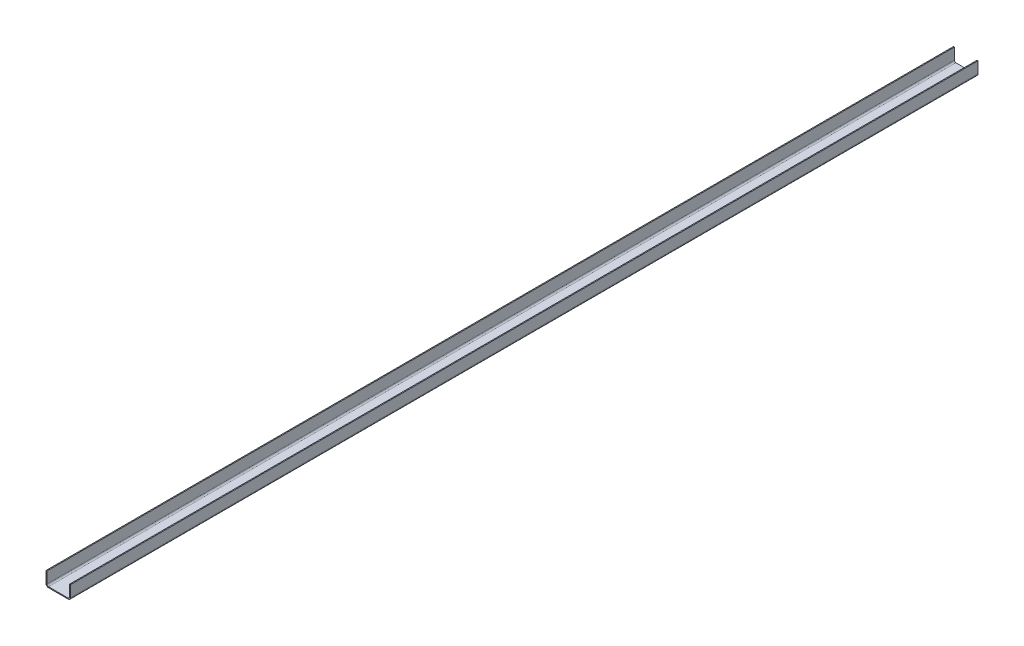
ISO-10303-21;
HEADER;
FILE_DESCRIPTION(('STEP AP214'),'2;1');
FILE_NAME('part.step','',(''),(''),'','','');
FILE_SCHEMA(('AUTOMOTIVE_DESIGN { 1 0 10303 214 1 1 1 1 }'));
ENDSEC;
DATA;
#1=APPLICATION_CONTEXT('core data for automotive mechanical design processes');
#2=APPLICATION_PROTOCOL_DEFINITION('international standard','automotive_design',2000,#1);
#3=PRODUCT_CONTEXT('',#1,'mechanical');
#4=PRODUCT('Part','Part','',(#3));
#5=PRODUCT_RELATED_PRODUCT_CATEGORY('part','',(#4));
#6=PRODUCT_DEFINITION_FORMATION('','',#4);
#7=PRODUCT_DEFINITION_CONTEXT('part definition',#1,'design');
#8=PRODUCT_DEFINITION('design','',#6,#7);
#9=PRODUCT_DEFINITION_SHAPE('','',#8);
#10=(LENGTH_UNIT() NAMED_UNIT(*) SI_UNIT(.MILLI.,.METRE.));
#11=(NAMED_UNIT(*) PLANE_ANGLE_UNIT() SI_UNIT($,.RADIAN.));
#12=(NAMED_UNIT(*) SI_UNIT($,.STERADIAN.) SOLID_ANGLE_UNIT());
#13=UNCERTAINTY_MEASURE_WITH_UNIT(LENGTH_MEASURE(1.E-05),#10,'distance_accuracy_value','');
#14=(GEOMETRIC_REPRESENTATION_CONTEXT(3) GLOBAL_UNCERTAINTY_ASSIGNED_CONTEXT((#13)) GLOBAL_UNIT_ASSIGNED_CONTEXT((#10,
#11,#12)) REPRESENTATION_CONTEXT('',''));
#15=CARTESIAN_POINT('',(0.,0.,0.));
#16=DIRECTION('',(0.,0.,1.));
#17=DIRECTION('',(1.,0.,0.));
#18=AXIS2_PLACEMENT_3D('',#15,#16,#17);
#19=CARTESIAN_POINT('',(2.,0.,1200.));
#20=DIRECTION('',(0.,0.,1.));
#21=DIRECTION('',(1.,0.,0.));
#22=AXIS2_PLACEMENT_3D('',#19,#20,#21);
#23=PLANE('',#22);
#24=DIRECTION('',(0.,-1.,0.));
#25=VECTOR('',#24,1.);
#26=CARTESIAN_POINT('',(2.,0.,1200.));
#27=LINE('',#26,#25);
#28=CARTESIAN_POINT('',(2.,0.,1200.));
#29=VERTEX_POINT('',#28);
#30=CARTESIAN_POINT('',(2.,-1.25,1200.));
#31=VERTEX_POINT('',#30);
#32=EDGE_CURVE('E11',#29,#31,#27,.T.);
#33=ORIENTED_EDGE('',*,*,#32,.F.);
#34=CARTESIAN_POINT('',(2.,2.,1200.));
#35=DIRECTION('',(0.,0.,-1.));
#36=DIRECTION('',(-1.,0.,0.));
#37=AXIS2_PLACEMENT_3D('',#34,#35,#36);
#38=CIRCLE('',#37,2.);
#39=CARTESIAN_POINT('',(0.,2.,1200.));
#40=VERTEX_POINT('',#39);
#41=EDGE_CURVE('E246',#40,#29,#38,.F.);
#42=ORIENTED_EDGE('',*,*,#41,.F.);
#43=DIRECTION('',(1.,0.,0.));
#44=VECTOR('',#43,1.);
#45=CARTESIAN_POINT('',(-1.25,2.,1200.));
#46=LINE('',#45,#44);
#47=CARTESIAN_POINT('',(-1.25,2.,1200.));
#48=VERTEX_POINT('',#47);
#49=EDGE_CURVE('E44',#48,#40,#46,.T.);
#50=ORIENTED_EDGE('',*,*,#49,.F.);
#51=CARTESIAN_POINT('',(2.,2.,1200.));
#52=DIRECTION('',(0.,0.,1.));
#53=DIRECTION('',(1.,0.,0.));
#54=AXIS2_PLACEMENT_3D('',#51,#52,#53);
#55=CIRCLE('',#54,3.25);
#56=EDGE_CURVE('E145',#48,#31,#55,.T.);
#57=ORIENTED_EDGE('',*,*,#56,.T.);
#58=EDGE_LOOP('',(#33,#42,#50,#57));
#59=FACE_BOUND('',#58,.T.);
#60=ADVANCED_FACE('F36',(#59),#23,.T.);
#61=CARTESIAN_POINT('',(-1.25,2.,1200.));
#62=DIRECTION('',(0.,0.,1.));
#63=DIRECTION('',(1.,0.,0.));
#64=AXIS2_PLACEMENT_3D('',#61,#62,#63);
#65=PLANE('',#64);
#66=DIRECTION('',(1.,0.,0.));
#67=VECTOR('',#66,1.);
#68=CARTESIAN_POINT('',(0.,0.,1200.));
#69=LINE('',#68,#67);
#70=CARTESIAN_POINT('',(28.,0.,1200.));
#71=VERTEX_POINT('',#70);
#72=EDGE_CURVE('E139',#29,#71,#69,.T.);
#73=ORIENTED_EDGE('',*,*,#72,.F.);
#74=ORIENTED_EDGE('',*,*,#32,.T.);
#75=DIRECTION('',(1.,0.,0.));
#76=VECTOR('',#75,1.);
#77=CARTESIAN_POINT('',(0.,-1.25,1200.));
#78=LINE('',#77,#76);
#79=CARTESIAN_POINT('',(28.,-1.25,1200.));
#80=VERTEX_POINT('',#79);
#81=EDGE_CURVE('E136',#31,#80,#78,.T.);
#82=ORIENTED_EDGE('',*,*,#81,.T.);
#83=DIRECTION('',(0.,1.,0.));
#84=VECTOR('',#83,1.);
#85=CARTESIAN_POINT('',(28.,-1.25,1200.));
#86=LINE('',#85,#84);
#87=EDGE_CURVE('E227',#80,#71,#86,.T.);
#88=ORIENTED_EDGE('',*,*,#87,.T.);
#89=EDGE_LOOP('',(#73,#74,#82,#88));
#90=FACE_BOUND('',#89,.T.);
#91=ADVANCED_FACE('F134',(#90),#65,.T.);
#92=CARTESIAN_POINT('',(0.,2.,0.));
#93=DIRECTION('',(0.,0.,-1.));
#94=DIRECTION('',(-1.,0.,0.));
#95=AXIS2_PLACEMENT_3D('',#92,#93,#94);
#96=PLANE('',#95);
#97=DIRECTION('',(-1.,0.,0.));
#98=VECTOR('',#97,1.);
#99=CARTESIAN_POINT('',(0.,2.,0.));
#100=LINE('',#99,#98);
#101=CARTESIAN_POINT('',(0.,2.,0.));
#102=VERTEX_POINT('',#101);
#103=CARTESIAN_POINT('',(-1.25,2.,0.));
#104=VERTEX_POINT('',#103);
#105=EDGE_CURVE('E232',#102,#104,#100,.T.);
#106=ORIENTED_EDGE('',*,*,#105,.F.);
#107=CARTESIAN_POINT('',(2.,2.,0.));
#108=DIRECTION('',(0.,0.,-1.));
#109=DIRECTION('',(-1.,0.,0.));
#110=AXIS2_PLACEMENT_3D('',#107,#108,#109);
#111=CIRCLE('',#110,2.);
#112=CARTESIAN_POINT('',(2.,0.,0.));
#113=VERTEX_POINT('',#112);
#114=EDGE_CURVE('E184',#102,#113,#111,.F.);
#115=ORIENTED_EDGE('',*,*,#114,.T.);
#116=DIRECTION('',(0.,1.,0.));
#117=VECTOR('',#116,1.);
#118=CARTESIAN_POINT('',(2.,-1.25,0.));
#119=LINE('',#118,#117);
#120=CARTESIAN_POINT('',(2.,-1.25,0.));
#121=VERTEX_POINT('',#120);
#122=EDGE_CURVE('E230',#121,#113,#119,.T.);
#123=ORIENTED_EDGE('',*,*,#122,.F.);
#124=CARTESIAN_POINT('',(2.,2.,0.));
#125=DIRECTION('',(0.,0.,1.));
#126=DIRECTION('',(1.,0.,0.));
#127=AXIS2_PLACEMENT_3D('',#124,#125,#126);
#128=CIRCLE('',#127,3.25);
#129=EDGE_CURVE('E157',#104,#121,#128,.T.);
#130=ORIENTED_EDGE('',*,*,#129,.F.);
#131=EDGE_LOOP('',(#106,#115,#123,#130));
#132=FACE_BOUND('',#131,.T.);
#133=ADVANCED_FACE('F284',(#132),#96,.T.);
#134=CARTESIAN_POINT('',(2.,-1.25,0.));
#135=DIRECTION('',(0.,0.,-1.));
#136=DIRECTION('',(-1.,0.,0.));
#137=AXIS2_PLACEMENT_3D('',#134,#135,#136);
#138=PLANE('',#137);
#139=DIRECTION('',(0.,-1.,0.));
#140=VECTOR('',#139,1.);
#141=CARTESIAN_POINT('',(0.,17.,0.));
#142=LINE('',#141,#140);
#143=CARTESIAN_POINT('',(0.,17.,0.));
#144=VERTEX_POINT('',#143);
#145=EDGE_CURVE('E187',#144,#102,#142,.T.);
#146=ORIENTED_EDGE('',*,*,#145,.T.);
#147=ORIENTED_EDGE('',*,*,#105,.T.);
#148=DIRECTION('',(0.,-1.,0.));
#149=VECTOR('',#148,1.);
#150=CARTESIAN_POINT('',(-1.25,17.,0.));
#151=LINE('',#150,#149);
#152=CARTESIAN_POINT('',(-1.25,17.,0.));
#153=VERTEX_POINT('',#152);
#154=EDGE_CURVE('E193',#153,#104,#151,.T.);
#155=ORIENTED_EDGE('',*,*,#154,.F.);
#156=DIRECTION('',(1.,0.,0.));
#157=VECTOR('',#156,1.);
#158=CARTESIAN_POINT('',(-1.25,17.,0.));
#159=LINE('',#158,#157);
#160=EDGE_CURVE('E190',#153,#144,#159,.T.);
#161=ORIENTED_EDGE('',*,*,#160,.T.);
#162=EDGE_LOOP('',(#146,#147,#155,#161));
#163=FACE_BOUND('',#162,.T.);
#164=ADVANCED_FACE('F287',(#163),#138,.T.);
#165=CARTESIAN_POINT('',(30.,2.,1200.));
#166=DIRECTION('',(0.,0.,1.));
#167=DIRECTION('',(1.,0.,0.));
#168=AXIS2_PLACEMENT_3D('',#165,#166,#167);
#169=PLANE('',#168);
#170=DIRECTION('',(1.,0.,0.));
#171=VECTOR('',#170,1.);
#172=CARTESIAN_POINT('',(30.,2.,1200.));
#173=LINE('',#172,#171);
#174=CARTESIAN_POINT('',(30.,2.,1200.));
#175=VERTEX_POINT('',#174);
#176=CARTESIAN_POINT('',(31.25,2.,1200.));
#177=VERTEX_POINT('',#176);
#178=EDGE_CURVE('E52',#175,#177,#173,.T.);
#179=ORIENTED_EDGE('',*,*,#178,.F.);
#180=CARTESIAN_POINT('',(28.,2.,1200.));
#181=DIRECTION('',(0.,0.,-1.));
#182=DIRECTION('',(-1.,0.,0.));
#183=AXIS2_PLACEMENT_3D('',#180,#181,#182);
#184=CIRCLE('',#183,2.);
#185=EDGE_CURVE('E256',#71,#175,#184,.F.);
#186=ORIENTED_EDGE('',*,*,#185,.F.);
#187=ORIENTED_EDGE('',*,*,#87,.F.);
#188=CARTESIAN_POINT('',(28.,2.,1200.));
#189=DIRECTION('',(0.,0.,1.));
#190=DIRECTION('',(1.,0.,0.));
#191=AXIS2_PLACEMENT_3D('',#188,#189,#190);
#192=CIRCLE('',#191,3.25);
#193=EDGE_CURVE('E165',#80,#177,#192,.T.);
#194=ORIENTED_EDGE('',*,*,#193,.T.);
#195=EDGE_LOOP('',(#179,#186,#187,#194));
#196=FACE_BOUND('',#195,.T.);
#197=ADVANCED_FACE('F279',(#196),#169,.T.);
#198=CARTESIAN_POINT('',(28.,-1.25,1200.));
#199=DIRECTION('',(0.,0.,1.));
#200=DIRECTION('',(1.,0.,0.));
#201=AXIS2_PLACEMENT_3D('',#198,#199,#200);
#202=PLANE('',#201);
#203=DIRECTION('',(0.,1.,0.));
#204=VECTOR('',#203,1.);
#205=CARTESIAN_POINT('',(30.,0.,1200.));
#206=LINE('',#205,#204);
#207=CARTESIAN_POINT('',(30.,17.,1200.));
#208=VERTEX_POINT('',#207);
#209=EDGE_CURVE('E259',#175,#208,#206,.T.);
#210=ORIENTED_EDGE('',*,*,#209,.F.);
#211=ORIENTED_EDGE('',*,*,#178,.T.);
#212=DIRECTION('',(0.,1.,0.));
#213=VECTOR('',#212,1.);
#214=CARTESIAN_POINT('',(31.25,0.,1200.));
#215=LINE('',#214,#213);
#216=CARTESIAN_POINT('',(31.25,17.,1200.));
#217=VERTEX_POINT('',#216);
#218=EDGE_CURVE('E106',#177,#217,#215,.T.);
#219=ORIENTED_EDGE('',*,*,#218,.T.);
#220=DIRECTION('',(1.,0.,0.));
#221=VECTOR('',#220,1.);
#222=CARTESIAN_POINT('',(30.,17.,1200.));
#223=LINE('',#222,#221);
#224=EDGE_CURVE('E262',#208,#217,#223,.T.);
#225=ORIENTED_EDGE('',*,*,#224,.F.);
#226=EDGE_LOOP('',(#210,#211,#219,#225));
#227=FACE_BOUND('',#226,.T.);
#228=ADVANCED_FACE('F268',(#227),#202,.T.);
#229=CARTESIAN_POINT('',(28.,0.,0.));
#230=DIRECTION('',(0.,0.,-1.));
#231=DIRECTION('',(-1.,0.,0.));
#232=AXIS2_PLACEMENT_3D('',#229,#230,#231);
#233=PLANE('',#232);
#234=DIRECTION('',(0.,-1.,0.));
#235=VECTOR('',#234,1.);
#236=CARTESIAN_POINT('',(28.,0.,0.));
#237=LINE('',#236,#235);
#238=CARTESIAN_POINT('',(28.,0.,0.));
#239=VERTEX_POINT('',#238);
#240=CARTESIAN_POINT('',(28.,-1.25,0.));
#241=VERTEX_POINT('',#240);
#242=EDGE_CURVE('E93',#239,#241,#237,.T.);
#243=ORIENTED_EDGE('',*,*,#242,.F.);
#244=CARTESIAN_POINT('',(28.,2.,0.));
#245=DIRECTION('',(0.,0.,-1.));
#246=DIRECTION('',(-1.,0.,0.));
#247=AXIS2_PLACEMENT_3D('',#244,#245,#246);
#248=CIRCLE('',#247,2.);
#249=CARTESIAN_POINT('',(30.,2.,0.));
#250=VERTEX_POINT('',#249);
#251=EDGE_CURVE('E180',#239,#250,#248,.F.);
#252=ORIENTED_EDGE('',*,*,#251,.T.);
#253=DIRECTION('',(-1.,0.,0.));
#254=VECTOR('',#253,1.);
#255=CARTESIAN_POINT('',(31.25,2.,0.));
#256=LINE('',#255,#254);
#257=CARTESIAN_POINT('',(31.25,2.,0.));
#258=VERTEX_POINT('',#257);
#259=EDGE_CURVE('E100',#258,#250,#256,.T.);
#260=ORIENTED_EDGE('',*,*,#259,.F.);
#261=CARTESIAN_POINT('',(28.,2.,0.));
#262=DIRECTION('',(0.,0.,1.));
#263=DIRECTION('',(1.,0.,0.));
#264=AXIS2_PLACEMENT_3D('',#261,#262,#263);
#265=CIRCLE('',#264,3.25);
#266=EDGE_CURVE('E199',#241,#258,#265,.T.);
#267=ORIENTED_EDGE('',*,*,#266,.F.);
#268=EDGE_LOOP('',(#243,#252,#260,#267));
#269=FACE_BOUND('',#268,.T.);
#270=ADVANCED_FACE('F316',(#269),#233,.T.);
#271=CARTESIAN_POINT('',(31.25,2.,0.));
#272=DIRECTION('',(0.,0.,-1.));
#273=DIRECTION('',(-1.,0.,0.));
#274=AXIS2_PLACEMENT_3D('',#271,#272,#273);
#275=PLANE('',#274);
#276=DIRECTION('',(1.,0.,0.));
#277=VECTOR('',#276,1.);
#278=CARTESIAN_POINT('',(0.,0.,0.));
#279=LINE('',#278,#277);
#280=EDGE_CURVE('E182',#113,#239,#279,.T.);
#281=ORIENTED_EDGE('',*,*,#280,.T.);
#282=ORIENTED_EDGE('',*,*,#242,.T.);
#283=DIRECTION('',(1.,0.,0.));
#284=VECTOR('',#283,1.);
#285=CARTESIAN_POINT('',(0.,-1.25,0.));
#286=LINE('',#285,#284);
#287=EDGE_CURVE('E197',#121,#241,#286,.T.);
#288=ORIENTED_EDGE('',*,*,#287,.F.);
#289=ORIENTED_EDGE('',*,*,#122,.T.);
#290=EDGE_LOOP('',(#281,#282,#288,#289));
#291=FACE_BOUND('',#290,.T.);
#292=ADVANCED_FACE('F319',(#291),#275,.T.);
#293=CARTESIAN_POINT('',(31.25,0.,1200.));
#294=DIRECTION('',(-1.,0.,0.));
#295=DIRECTION('',(0.,0.,1.));
#296=AXIS2_PLACEMENT_3D('',#293,#294,#295);
#297=PLANE('',#296);
#298=DIRECTION('',(0.,1.,0.));
#299=VECTOR('',#298,1.);
#300=CARTESIAN_POINT('',(31.25,0.,0.));
#301=LINE('',#300,#299);
#302=CARTESIAN_POINT('',(31.25,17.,0.));
#303=VERTEX_POINT('',#302);
#304=EDGE_CURVE('E171',#258,#303,#301,.T.);
#305=ORIENTED_EDGE('',*,*,#304,.T.);
#306=DIRECTION('',(0.,0.,-1.));
#307=VECTOR('',#306,1.);
#308=CARTESIAN_POINT('',(31.25,17.,1200.));
#309=LINE('',#308,#307);
#310=EDGE_CURVE('E223',#217,#303,#309,.T.);
#311=ORIENTED_EDGE('',*,*,#310,.F.);
#312=ORIENTED_EDGE('',*,*,#218,.F.);
#313=DIRECTION('',(0.,0.,-1.));
#314=VECTOR('',#313,1.);
#315=CARTESIAN_POINT('',(31.25,2.,1200.));
#316=LINE('',#315,#314);
#317=EDGE_CURVE('E167',#177,#258,#316,.T.);
#318=ORIENTED_EDGE('',*,*,#317,.T.);
#319=EDGE_LOOP('',(#305,#311,#312,#318));
#320=FACE_BOUND('',#319,.T.);
#321=ADVANCED_FACE('F322',(#320),#297,.F.);
#322=CARTESIAN_POINT('',(30.,17.,1200.));
#323=DIRECTION('',(0.,1.,0.));
#324=DIRECTION('',(0.,0.,1.));
#325=AXIS2_PLACEMENT_3D('',#322,#323,#324);
#326=PLANE('',#325);
#327=DIRECTION('',(1.,0.,0.));
#328=VECTOR('',#327,1.);
#329=CARTESIAN_POINT('',(30.,17.,0.));
#330=LINE('',#329,#328);
#331=CARTESIAN_POINT('',(30.,17.,0.));
#332=VERTEX_POINT('',#331);
#333=EDGE_CURVE('E174',#332,#303,#330,.T.);
#334=ORIENTED_EDGE('',*,*,#333,.F.);
#335=DIRECTION('',(0.,0.,-1.));
#336=VECTOR('',#335,1.);
#337=CARTESIAN_POINT('',(30.,17.,1200.));
#338=LINE('',#337,#336);
#339=EDGE_CURVE('E221',#208,#332,#338,.T.);
#340=ORIENTED_EDGE('',*,*,#339,.F.);
#341=ORIENTED_EDGE('',*,*,#224,.T.);
#342=ORIENTED_EDGE('',*,*,#310,.T.);
#343=EDGE_LOOP('',(#334,#340,#341,#342));
#344=FACE_BOUND('',#343,.T.);
#345=ADVANCED_FACE('F267',(#344),#326,.T.);
#346=CARTESIAN_POINT('',(30.,0.,1200.));
#347=DIRECTION('',(-1.,0.,0.));
#348=DIRECTION('',(0.,0.,1.));
#349=AXIS2_PLACEMENT_3D('',#346,#347,#348);
#350=PLANE('',#349);
#351=DIRECTION('',(0.,1.,0.));
#352=VECTOR('',#351,1.);
#353=CARTESIAN_POINT('',(30.,0.,0.));
#354=LINE('',#353,#352);
#355=EDGE_CURVE('E177',#250,#332,#354,.T.);
#356=ORIENTED_EDGE('',*,*,#355,.F.);
#357=DIRECTION('',(0.,0.,-1.));
#358=VECTOR('',#357,1.);
#359=CARTESIAN_POINT('',(30.,2.,1200.));
#360=LINE('',#359,#358);
#361=EDGE_CURVE('E218',#175,#250,#360,.T.);
#362=ORIENTED_EDGE('',*,*,#361,.F.);
#363=ORIENTED_EDGE('',*,*,#209,.T.);
#364=ORIENTED_EDGE('',*,*,#339,.T.);
#365=EDGE_LOOP('',(#356,#362,#363,#364));
#366=FACE_BOUND('',#365,.T.);
#367=ADVANCED_FACE('F272',(#366),#350,.T.);
#368=CARTESIAN_POINT('',(28.,2.,1200.));
#369=DIRECTION('',(0.,0.,-1.));
#370=DIRECTION('',(-1.,0.,0.));
#371=AXIS2_PLACEMENT_3D('',#368,#369,#370);
#372=CYLINDRICAL_SURFACE('',#371,2.);
#373=ORIENTED_EDGE('',*,*,#251,.F.);
#374=DIRECTION('',(0.,0.,-1.));
#375=VECTOR('',#374,1.);
#376=CARTESIAN_POINT('',(28.,0.,1200.));
#377=LINE('',#376,#375);
#378=EDGE_CURVE('E215',#71,#239,#377,.T.);
#379=ORIENTED_EDGE('',*,*,#378,.F.);
#380=ORIENTED_EDGE('',*,*,#185,.T.);
#381=ORIENTED_EDGE('',*,*,#361,.T.);
#382=EDGE_LOOP('',(#373,#379,#380,#381));
#383=FACE_BOUND('',#382,.T.);
#384=ADVANCED_FACE('F275',(#383),#372,.F.);
#385=CARTESIAN_POINT('',(0.,0.,1200.));
#386=DIRECTION('',(0.,1.,0.));
#387=DIRECTION('',(0.,0.,1.));
#388=AXIS2_PLACEMENT_3D('',#385,#386,#387);
#389=PLANE('',#388);
#390=ORIENTED_EDGE('',*,*,#280,.F.);
#391=DIRECTION('',(0.,0.,-1.));
#392=VECTOR('',#391,1.);
#393=CARTESIAN_POINT('',(2.,0.,1200.));
#394=LINE('',#393,#392);
#395=EDGE_CURVE('E212',#29,#113,#394,.T.);
#396=ORIENTED_EDGE('',*,*,#395,.F.);
#397=ORIENTED_EDGE('',*,*,#72,.T.);
#398=ORIENTED_EDGE('',*,*,#378,.T.);
#399=EDGE_LOOP('',(#390,#396,#397,#398));
#400=FACE_BOUND('',#399,.T.);
#401=ADVANCED_FACE('F282',(#400),#389,.T.);
#402=CARTESIAN_POINT('',(2.,2.,1200.));
#403=DIRECTION('',(0.,0.,-1.));
#404=DIRECTION('',(-1.,0.,0.));
#405=AXIS2_PLACEMENT_3D('',#402,#403,#404);
#406=CYLINDRICAL_SURFACE('',#405,2.);
#407=ORIENTED_EDGE('',*,*,#114,.F.);
#408=DIRECTION('',(0.,0.,-1.));
#409=VECTOR('',#408,1.);
#410=CARTESIAN_POINT('',(0.,2.,1200.));
#411=LINE('',#410,#409);
#412=EDGE_CURVE('E209',#40,#102,#411,.T.);
#413=ORIENTED_EDGE('',*,*,#412,.F.);
#414=ORIENTED_EDGE('',*,*,#41,.T.);
#415=ORIENTED_EDGE('',*,*,#395,.T.);
#416=EDGE_LOOP('',(#407,#413,#414,#415));
#417=FACE_BOUND('',#416,.T.);
#418=ADVANCED_FACE('F245',(#417),#406,.F.);
#419=CARTESIAN_POINT('',(0.,17.,1200.));
#420=DIRECTION('',(1.,0.,0.));
#421=DIRECTION('',(0.,1.,0.));
#422=AXIS2_PLACEMENT_3D('',#419,#420,#421);
#423=PLANE('',#422);
#424=ORIENTED_EDGE('',*,*,#145,.F.);
#425=DIRECTION('',(0.,0.,-1.));
#426=VECTOR('',#425,1.);
#427=CARTESIAN_POINT('',(0.,17.,1200.));
#428=LINE('',#427,#426);
#429=CARTESIAN_POINT('',(0.,17.,1200.));
#430=VERTEX_POINT('',#429);
#431=EDGE_CURVE('E207',#430,#144,#428,.T.);
#432=ORIENTED_EDGE('',*,*,#431,.F.);
#433=DIRECTION('',(0.,-1.,0.));
#434=VECTOR('',#433,1.);
#435=CARTESIAN_POINT('',(0.,17.,1200.));
#436=LINE('',#435,#434);
#437=EDGE_CURVE('E239',#430,#40,#436,.T.);
#438=ORIENTED_EDGE('',*,*,#437,.T.);
#439=ORIENTED_EDGE('',*,*,#412,.T.);
#440=EDGE_LOOP('',(#424,#432,#438,#439));
#441=FACE_BOUND('',#440,.T.);
#442=ADVANCED_FACE('F250',(#441),#423,.T.);
#443=CARTESIAN_POINT('',(-1.25,17.,1200.));
#444=DIRECTION('',(0.,1.,0.));
#445=DIRECTION('',(0.,0.,1.));
#446=AXIS2_PLACEMENT_3D('',#443,#444,#445);
#447=PLANE('',#446);
#448=ORIENTED_EDGE('',*,*,#160,.F.);
#449=DIRECTION('',(0.,0.,-1.));
#450=VECTOR('',#449,1.);
#451=CARTESIAN_POINT('',(-1.25,17.,1200.));
#452=LINE('',#451,#450);
#453=CARTESIAN_POINT('',(-1.25,17.,1200.));
#454=VERTEX_POINT('',#453);
#455=EDGE_CURVE('E205',#454,#153,#452,.T.);
#456=ORIENTED_EDGE('',*,*,#455,.F.);
#457=DIRECTION('',(1.,0.,0.));
#458=VECTOR('',#457,1.);
#459=CARTESIAN_POINT('',(-1.25,17.,1200.));
#460=LINE('',#459,#458);
#461=EDGE_CURVE('E251',#454,#430,#460,.T.);
#462=ORIENTED_EDGE('',*,*,#461,.T.);
#463=ORIENTED_EDGE('',*,*,#431,.T.);
#464=EDGE_LOOP('',(#448,#456,#462,#463));
#465=FACE_BOUND('',#464,.T.);
#466=ADVANCED_FACE('F292',(#465),#447,.T.);
#467=CARTESIAN_POINT('',(-1.25,17.,1200.));
#468=DIRECTION('',(1.,0.,0.));
#469=DIRECTION('',(0.,1.,0.));
#470=AXIS2_PLACEMENT_3D('',#467,#468,#469);
#471=PLANE('',#470);
#472=ORIENTED_EDGE('',*,*,#154,.T.);
#473=DIRECTION('',(0.,0.,-1.));
#474=VECTOR('',#473,1.);
#475=CARTESIAN_POINT('',(-1.25,2.,1200.));
#476=LINE('',#475,#474);
#477=EDGE_CURVE('E159',#48,#104,#476,.T.);
#478=ORIENTED_EDGE('',*,*,#477,.F.);
#479=DIRECTION('',(0.,-1.,0.));
#480=VECTOR('',#479,1.);
#481=CARTESIAN_POINT('',(-1.25,17.,1200.));
#482=LINE('',#481,#480);
#483=EDGE_CURVE('E150',#454,#48,#482,.T.);
#484=ORIENTED_EDGE('',*,*,#483,.F.);
#485=ORIENTED_EDGE('',*,*,#455,.T.);
#486=EDGE_LOOP('',(#472,#478,#484,#485));
#487=FACE_BOUND('',#486,.T.);
#488=ADVANCED_FACE('F290',(#487),#471,.F.);
#489=CARTESIAN_POINT('',(2.,2.,1200.));
#490=DIRECTION('',(0.,0.,-1.));
#491=DIRECTION('',(-1.,0.,0.));
#492=AXIS2_PLACEMENT_3D('',#489,#490,#491);
#493=CYLINDRICAL_SURFACE('',#492,3.25);
#494=ORIENTED_EDGE('',*,*,#129,.T.);
#495=DIRECTION('',(0.,0.,-1.));
#496=VECTOR('',#495,1.);
#497=CARTESIAN_POINT('',(2.,-1.25,1200.));
#498=LINE('',#497,#496);
#499=EDGE_CURVE('E154',#31,#121,#498,.T.);
#500=ORIENTED_EDGE('',*,*,#499,.F.);
#501=ORIENTED_EDGE('',*,*,#56,.F.);
#502=ORIENTED_EDGE('',*,*,#477,.T.);
#503=EDGE_LOOP('',(#494,#500,#501,#502));
#504=FACE_BOUND('',#503,.T.);
#505=ADVANCED_FACE('F155',(#504),#493,.T.);
#506=CARTESIAN_POINT('',(0.,-1.25,1200.));
#507=DIRECTION('',(0.,1.,0.));
#508=DIRECTION('',(0.,0.,1.));
#509=AXIS2_PLACEMENT_3D('',#506,#507,#508);
#510=PLANE('',#509);
#511=ORIENTED_EDGE('',*,*,#287,.T.);
#512=DIRECTION('',(0.,0.,-1.));
#513=VECTOR('',#512,1.);
#514=CARTESIAN_POINT('',(28.,-1.25,1200.));
#515=LINE('',#514,#513);
#516=EDGE_CURVE('E160',#80,#241,#515,.T.);
#517=ORIENTED_EDGE('',*,*,#516,.F.);
#518=ORIENTED_EDGE('',*,*,#81,.F.);
#519=ORIENTED_EDGE('',*,*,#499,.T.);
#520=EDGE_LOOP('',(#511,#517,#518,#519));
#521=FACE_BOUND('',#520,.T.);
#522=ADVANCED_FACE('F162',(#521),#510,.F.);
#523=CARTESIAN_POINT('',(28.,2.,1200.));
#524=DIRECTION('',(0.,0.,-1.));
#525=DIRECTION('',(-1.,0.,0.));
#526=AXIS2_PLACEMENT_3D('',#523,#524,#525);
#527=CYLINDRICAL_SURFACE('',#526,3.25);
#528=ORIENTED_EDGE('',*,*,#266,.T.);
#529=ORIENTED_EDGE('',*,*,#317,.F.);
#530=ORIENTED_EDGE('',*,*,#193,.F.);
#531=ORIENTED_EDGE('',*,*,#516,.T.);
#532=EDGE_LOOP('',(#528,#529,#530,#531));
#533=FACE_BOUND('',#532,.T.);
#534=ADVANCED_FACE('F374',(#533),#527,.T.);
#535=CARTESIAN_POINT('',(28.,2.,1200.));
#536=DIRECTION('',(0.,0.,-1.));
#537=DIRECTION('',(-1.,0.,0.));
#538=AXIS2_PLACEMENT_3D('',#535,#536,#537);
#539=PLANE('',#538);
#540=ORIENTED_EDGE('',*,*,#483,.T.);
#541=ORIENTED_EDGE('',*,*,#49,.T.);
#542=ORIENTED_EDGE('',*,*,#437,.F.);
#543=ORIENTED_EDGE('',*,*,#461,.F.);
#544=EDGE_LOOP('',(#540,#541,#542,#543));
#545=FACE_BOUND('',#544,.T.);
#546=ADVANCED_FACE('F236',(#545),#539,.F.);
#547=CARTESIAN_POINT('',(28.,2.,0.));
#548=DIRECTION('',(0.,0.,-1.));
#549=DIRECTION('',(-1.,0.,0.));
#550=AXIS2_PLACEMENT_3D('',#547,#548,#549);
#551=PLANE('',#550);
#552=ORIENTED_EDGE('',*,*,#304,.F.);
#553=ORIENTED_EDGE('',*,*,#259,.T.);
#554=ORIENTED_EDGE('',*,*,#355,.T.);
#555=ORIENTED_EDGE('',*,*,#333,.T.);
#556=EDGE_LOOP('',(#552,#553,#554,#555));
#557=FACE_BOUND('',#556,.T.);
#558=ADVANCED_FACE('F394',(#557),#551,.T.);
#559=CLOSED_SHELL('',(#60,#91,#133,#164,#197,#228,#270,#292,#321,#345,#367,#384,#401,#418,#442,
#466,#488,#505,#522,#534,#546,#558));
#560=MANIFOLD_SOLID_BREP('B2',#559);
#561=ADVANCED_BREP_SHAPE_REPRESENTATION('',(#18,#560),#14);
#562=SHAPE_DEFINITION_REPRESENTATION(#9,#561);
ENDSEC;
END-ISO-10303-21;
